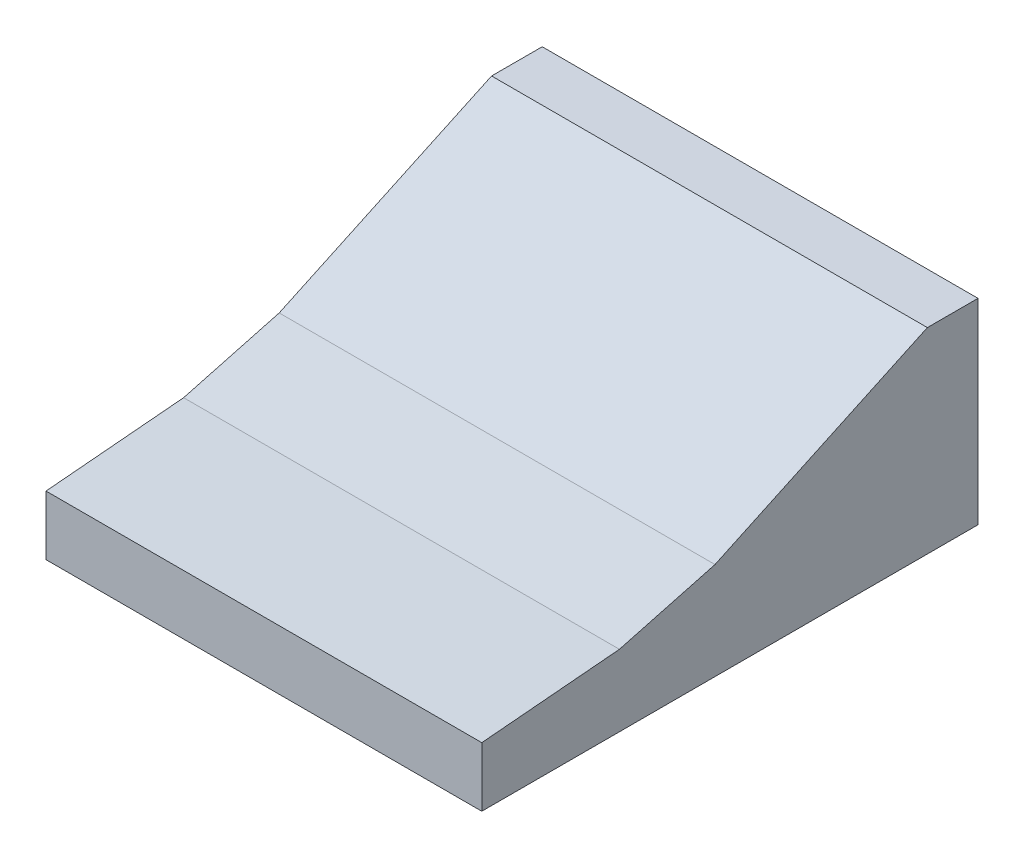
ISO-10303-21;
HEADER;
FILE_DESCRIPTION(('STEP AP214'),'2;1');
FILE_NAME('part.step','',(''),(''),'','','');
FILE_SCHEMA(('AUTOMOTIVE_DESIGN { 1 0 10303 214 1 1 1 1 }'));
ENDSEC;
DATA;
#1=APPLICATION_CONTEXT('core data for automotive mechanical design processes');
#2=APPLICATION_PROTOCOL_DEFINITION('international standard','automotive_design',2000,#1);
#3=PRODUCT_CONTEXT('',#1,'mechanical');
#4=PRODUCT('Part','Part','',(#3));
#5=PRODUCT_RELATED_PRODUCT_CATEGORY('part','',(#4));
#6=PRODUCT_DEFINITION_FORMATION('','',#4);
#7=PRODUCT_DEFINITION_CONTEXT('part definition',#1,'design');
#8=PRODUCT_DEFINITION('design','',#6,#7);
#9=PRODUCT_DEFINITION_SHAPE('','',#8);
#10=(LENGTH_UNIT() NAMED_UNIT(*) SI_UNIT(.MILLI.,.METRE.));
#11=(NAMED_UNIT(*) PLANE_ANGLE_UNIT() SI_UNIT($,.RADIAN.));
#12=(NAMED_UNIT(*) SI_UNIT($,.STERADIAN.) SOLID_ANGLE_UNIT());
#13=UNCERTAINTY_MEASURE_WITH_UNIT(LENGTH_MEASURE(1.E-05),#10,'distance_accuracy_value','');
#14=(GEOMETRIC_REPRESENTATION_CONTEXT(3) GLOBAL_UNCERTAINTY_ASSIGNED_CONTEXT((#13)) GLOBAL_UNIT_ASSIGNED_CONTEXT((#10,
#11,#12)) REPRESENTATION_CONTEXT('',''));
#15=CARTESIAN_POINT('',(0.,0.,0.));
#16=DIRECTION('',(0.,0.,1.));
#17=DIRECTION('',(1.,0.,0.));
#18=AXIS2_PLACEMENT_3D('',#15,#16,#17);
#19=CARTESIAN_POINT('',(440.,0.,0.));
#20=DIRECTION('',(0.,0.,-1.));
#21=DIRECTION('',(-1.,0.,0.));
#22=AXIS2_PLACEMENT_3D('',#19,#20,#21);
#23=PLANE('',#22);
#24=DIRECTION('',(0.,-1.,0.));
#25=VECTOR('',#24,1.);
#26=CARTESIAN_POINT('',(0.,0.,0.));
#27=LINE('',#26,#25);
#28=CARTESIAN_POINT('',(0.,60.,0.));
#29=VERTEX_POINT('',#28);
#30=CARTESIAN_POINT('',(0.,0.,0.));
#31=VERTEX_POINT('',#30);
#32=EDGE_CURVE('E123',#29,#31,#27,.T.);
#33=ORIENTED_EDGE('',*,*,#32,.T.);
#34=DIRECTION('',(-1.,0.,0.));
#35=VECTOR('',#34,1.);
#36=CARTESIAN_POINT('',(440.,0.,0.));
#37=LINE('',#36,#35);
#38=CARTESIAN_POINT('',(440.,0.,0.));
#39=VERTEX_POINT('',#38);
#40=EDGE_CURVE('E11',#39,#31,#37,.T.);
#41=ORIENTED_EDGE('',*,*,#40,.F.);
#42=DIRECTION('',(0.,-1.,0.));
#43=VECTOR('',#42,1.);
#44=CARTESIAN_POINT('',(440.,0.,0.));
#45=LINE('',#44,#43);
#46=CARTESIAN_POINT('',(440.,60.,0.));
#47=VERTEX_POINT('',#46);
#48=EDGE_CURVE('E135',#47,#39,#45,.T.);
#49=ORIENTED_EDGE('',*,*,#48,.F.);
#50=DIRECTION('',(-1.,0.,0.));
#51=VECTOR('',#50,1.);
#52=CARTESIAN_POINT('',(440.,60.,0.));
#53=LINE('',#52,#51);
#54=EDGE_CURVE('E119',#47,#29,#53,.T.);
#55=ORIENTED_EDGE('',*,*,#54,.T.);
#56=EDGE_LOOP('',(#33,#41,#49,#55));
#57=FACE_BOUND('',#56,.T.);
#58=ADVANCED_FACE('F33',(#57),#23,.F.);
#59=CARTESIAN_POINT('',(440.,0.,-501.));
#60=DIRECTION('',(0.,1.,0.));
#61=DIRECTION('',(0.,0.,1.));
#62=AXIS2_PLACEMENT_3D('',#59,#60,#61);
#63=PLANE('',#62);
#64=DIRECTION('',(0.,0.,-1.));
#65=VECTOR('',#64,1.);
#66=CARTESIAN_POINT('',(0.,0.,-501.));
#67=LINE('',#66,#65);
#68=CARTESIAN_POINT('',(0.,0.,-501.));
#69=VERTEX_POINT('',#68);
#70=EDGE_CURVE('E126',#31,#69,#67,.T.);
#71=ORIENTED_EDGE('',*,*,#70,.T.);
#72=DIRECTION('',(-1.,0.,0.));
#73=VECTOR('',#72,1.);
#74=CARTESIAN_POINT('',(440.,0.,-501.));
#75=LINE('',#74,#73);
#76=CARTESIAN_POINT('',(440.,0.,-501.));
#77=VERTEX_POINT('',#76);
#78=EDGE_CURVE('E41',#77,#69,#75,.T.);
#79=ORIENTED_EDGE('',*,*,#78,.F.);
#80=DIRECTION('',(0.,0.,-1.));
#81=VECTOR('',#80,1.);
#82=CARTESIAN_POINT('',(440.,0.,-501.));
#83=LINE('',#82,#81);
#84=EDGE_CURVE('E89',#39,#77,#83,.T.);
#85=ORIENTED_EDGE('',*,*,#84,.F.);
#86=ORIENTED_EDGE('',*,*,#40,.T.);
#87=EDGE_LOOP('',(#71,#79,#85,#86));
#88=FACE_BOUND('',#87,.T.);
#89=ADVANCED_FACE('F160',(#88),#63,.F.);
#90=CARTESIAN_POINT('',(440.,198.,-501.));
#91=DIRECTION('',(0.,0.,1.));
#92=DIRECTION('',(1.,0.,0.));
#93=AXIS2_PLACEMENT_3D('',#90,#91,#92);
#94=PLANE('',#93);
#95=DIRECTION('',(0.,1.,0.));
#96=VECTOR('',#95,1.);
#97=CARTESIAN_POINT('',(0.,198.,-501.));
#98=LINE('',#97,#96);
#99=CARTESIAN_POINT('',(0.,198.,-501.));
#100=VERTEX_POINT('',#99);
#101=EDGE_CURVE('E128',#69,#100,#98,.T.);
#102=ORIENTED_EDGE('',*,*,#101,.T.);
#103=DIRECTION('',(-1.,0.,0.));
#104=VECTOR('',#103,1.);
#105=CARTESIAN_POINT('',(440.,198.,-501.));
#106=LINE('',#105,#104);
#107=CARTESIAN_POINT('',(440.,198.,-501.));
#108=VERTEX_POINT('',#107);
#109=EDGE_CURVE('E139',#108,#100,#106,.T.);
#110=ORIENTED_EDGE('',*,*,#109,.F.);
#111=DIRECTION('',(0.,1.,0.));
#112=VECTOR('',#111,1.);
#113=CARTESIAN_POINT('',(440.,198.,-501.));
#114=LINE('',#113,#112);
#115=EDGE_CURVE('E147',#77,#108,#114,.T.);
#116=ORIENTED_EDGE('',*,*,#115,.F.);
#117=ORIENTED_EDGE('',*,*,#78,.T.);
#118=EDGE_LOOP('',(#102,#110,#116,#117));
#119=FACE_BOUND('',#118,.T.);
#120=ADVANCED_FACE('F145',(#119),#94,.F.);
#121=CARTESIAN_POINT('',(440.,198.,-449.879135089899));
#122=DIRECTION('',(0.,-1.,0.));
#123=DIRECTION('',(0.,0.,-1.));
#124=AXIS2_PLACEMENT_3D('',#121,#122,#123);
#125=PLANE('',#124);
#126=DIRECTION('',(0.,0.,1.));
#127=VECTOR('',#126,1.);
#128=CARTESIAN_POINT('',(0.,198.,-449.879135089899));
#129=LINE('',#128,#127);
#130=CARTESIAN_POINT('',(0.,198.,-449.879135089899));
#131=VERTEX_POINT('',#130);
#132=EDGE_CURVE('E130',#100,#131,#129,.T.);
#133=ORIENTED_EDGE('',*,*,#132,.T.);
#134=DIRECTION('',(-1.,0.,0.));
#135=VECTOR('',#134,1.);
#136=CARTESIAN_POINT('',(440.,198.,-449.879135089899));
#137=LINE('',#136,#135);
#138=CARTESIAN_POINT('',(440.,198.,-449.879135089899));
#139=VERTEX_POINT('',#138);
#140=EDGE_CURVE('E114',#139,#131,#137,.T.);
#141=ORIENTED_EDGE('',*,*,#140,.F.);
#142=DIRECTION('',(0.,0.,1.));
#143=VECTOR('',#142,1.);
#144=CARTESIAN_POINT('',(440.,198.,-449.879135089899));
#145=LINE('',#144,#143);
#146=EDGE_CURVE('E105',#108,#139,#145,.T.);
#147=ORIENTED_EDGE('',*,*,#146,.F.);
#148=ORIENTED_EDGE('',*,*,#109,.T.);
#149=EDGE_LOOP('',(#133,#141,#147,#148));
#150=FACE_BOUND('',#149,.T.);
#151=ADVANCED_FACE('F153',(#150),#125,.F.);
#152=CARTESIAN_POINT('',(440.,98.0136753643289,-235.457769952384));
#153=DIRECTION('',(0.,-0.906307787036652,-0.422618261740694));
#154=DIRECTION('',(0.,0.422618261740695,-0.906307787036652));
#155=AXIS2_PLACEMENT_3D('',#152,#153,#154);
#156=PLANE('',#155);
#157=DIRECTION('',(0.,-0.422618261740694,0.906307787036652));
#158=VECTOR('',#157,1.);
#159=CARTESIAN_POINT('',(0.,98.0136753643289,-235.457769952384));
#160=LINE('',#159,#158);
#161=CARTESIAN_POINT('',(0.,98.0136753643289,-235.457769952384));
#162=VERTEX_POINT('',#161);
#163=EDGE_CURVE('E113',#131,#162,#160,.T.);
#164=ORIENTED_EDGE('',*,*,#163,.T.);
#165=DIRECTION('',(-1.,0.,0.));
#166=VECTOR('',#165,1.);
#167=CARTESIAN_POINT('',(440.,98.0136753643289,-235.457769952384));
#168=LINE('',#167,#166);
#169=CARTESIAN_POINT('',(440.,98.0136753643289,-235.457769952384));
#170=VERTEX_POINT('',#169);
#171=EDGE_CURVE('E110',#170,#162,#168,.T.);
#172=ORIENTED_EDGE('',*,*,#171,.F.);
#173=DIRECTION('',(0.,-0.422618261740694,0.906307787036652));
#174=VECTOR('',#173,1.);
#175=CARTESIAN_POINT('',(440.,98.0136753643289,-235.457769952384));
#176=LINE('',#175,#174);
#177=EDGE_CURVE('E99',#139,#170,#176,.T.);
#178=ORIENTED_EDGE('',*,*,#177,.F.);
#179=ORIENTED_EDGE('',*,*,#140,.T.);
#180=EDGE_LOOP('',(#164,#172,#178,#179));
#181=FACE_BOUND('',#180,.T.);
#182=ADVANCED_FACE('F111',(#181),#156,.F.);
#183=CARTESIAN_POINT('',(440.,72.157545327669,-138.961378968459));
#184=DIRECTION('',(0.,-0.96592582628907,-0.258819045102514));
#185=DIRECTION('',(0.,0.258819045102514,-0.96592582628907));
#186=AXIS2_PLACEMENT_3D('',#183,#184,#185);
#187=PLANE('',#186);
#188=DIRECTION('',(0.,-0.258819045102514,0.96592582628907));
#189=VECTOR('',#188,1.);
#190=CARTESIAN_POINT('',(0.,72.157545327669,-138.961378968459));
#191=LINE('',#190,#189);
#192=CARTESIAN_POINT('',(0.,72.157545327669,-138.961378968459));
#193=VERTEX_POINT('',#192);
#194=EDGE_CURVE('E75',#162,#193,#191,.T.);
#195=ORIENTED_EDGE('',*,*,#194,.T.);
#196=DIRECTION('',(-1.,0.,0.));
#197=VECTOR('',#196,1.);
#198=CARTESIAN_POINT('',(440.,72.157545327669,-138.961378968459));
#199=LINE('',#198,#197);
#200=CARTESIAN_POINT('',(440.,72.157545327669,-138.961378968459));
#201=VERTEX_POINT('',#200);
#202=EDGE_CURVE('E115',#201,#193,#199,.T.);
#203=ORIENTED_EDGE('',*,*,#202,.F.);
#204=DIRECTION('',(0.,-0.258819045102514,0.96592582628907));
#205=VECTOR('',#204,1.);
#206=CARTESIAN_POINT('',(440.,72.157545327669,-138.961378968459));
#207=LINE('',#206,#205);
#208=EDGE_CURVE('E103',#170,#201,#207,.T.);
#209=ORIENTED_EDGE('',*,*,#208,.F.);
#210=ORIENTED_EDGE('',*,*,#171,.T.);
#211=EDGE_LOOP('',(#195,#203,#209,#210));
#212=FACE_BOUND('',#211,.T.);
#213=ADVANCED_FACE('F117',(#212),#187,.F.);
#214=CARTESIAN_POINT('',(440.,60.,0.));
#215=DIRECTION('',(0.,-0.996194698091746,-0.0871557427476517));
#216=DIRECTION('',(0.,0.0871557427476517,-0.996194698091746));
#217=AXIS2_PLACEMENT_3D('',#214,#215,#216);
#218=PLANE('',#217);
#219=DIRECTION('',(0.,-0.0871557427476517,0.996194698091746));
#220=VECTOR('',#219,1.);
#221=CARTESIAN_POINT('',(0.,60.,0.));
#222=LINE('',#221,#220);
#223=EDGE_CURVE('E81',#193,#29,#222,.T.);
#224=ORIENTED_EDGE('',*,*,#223,.T.);
#225=ORIENTED_EDGE('',*,*,#54,.F.);
#226=DIRECTION('',(0.,-0.0871557427476517,0.996194698091746));
#227=VECTOR('',#226,1.);
#228=CARTESIAN_POINT('',(440.,60.,0.));
#229=LINE('',#228,#227);
#230=EDGE_CURVE('E49',#201,#47,#229,.T.);
#231=ORIENTED_EDGE('',*,*,#230,.F.);
#232=ORIENTED_EDGE('',*,*,#202,.T.);
#233=EDGE_LOOP('',(#224,#225,#231,#232));
#234=FACE_BOUND('',#233,.T.);
#235=ADVANCED_FACE('F174',(#234),#218,.F.);
#236=CARTESIAN_POINT('',(440.,0.,0.));
#237=DIRECTION('',(-1.,0.,0.));
#238=DIRECTION('',(0.,0.,1.));
#239=AXIS2_PLACEMENT_3D('',#236,#237,#238);
#240=PLANE('',#239);
#241=ORIENTED_EDGE('',*,*,#48,.T.);
#242=ORIENTED_EDGE('',*,*,#84,.T.);
#243=ORIENTED_EDGE('',*,*,#115,.T.);
#244=ORIENTED_EDGE('',*,*,#146,.T.);
#245=ORIENTED_EDGE('',*,*,#177,.T.);
#246=ORIENTED_EDGE('',*,*,#208,.T.);
#247=ORIENTED_EDGE('',*,*,#230,.T.);
#248=EDGE_LOOP('',(#241,#242,#243,#244,#245,#246,#247));
#249=FACE_BOUND('',#248,.T.);
#250=ADVANCED_FACE('F101',(#249),#240,.F.);
#251=CARTESIAN_POINT('',(0.,0.,0.));
#252=DIRECTION('',(-1.,0.,0.));
#253=DIRECTION('',(0.,0.,1.));
#254=AXIS2_PLACEMENT_3D('',#251,#252,#253);
#255=PLANE('',#254);
#256=ORIENTED_EDGE('',*,*,#32,.F.);
#257=ORIENTED_EDGE('',*,*,#223,.F.);
#258=ORIENTED_EDGE('',*,*,#194,.F.);
#259=ORIENTED_EDGE('',*,*,#163,.F.);
#260=ORIENTED_EDGE('',*,*,#132,.F.);
#261=ORIENTED_EDGE('',*,*,#101,.F.);
#262=ORIENTED_EDGE('',*,*,#70,.F.);
#263=EDGE_LOOP('',(#256,#257,#258,#259,#260,#261,#262));
#264=FACE_BOUND('',#263,.T.);
#265=ADVANCED_FACE('F151',(#264),#255,.T.);
#266=CLOSED_SHELL('',(#58,#89,#120,#151,#182,#213,#235,#250,#265));
#267=MANIFOLD_SOLID_BREP('B2',#266);
#268=ADVANCED_BREP_SHAPE_REPRESENTATION('',(#18,#267),#14);
#269=SHAPE_DEFINITION_REPRESENTATION(#9,#268);
ENDSEC;
END-ISO-10303-21;
